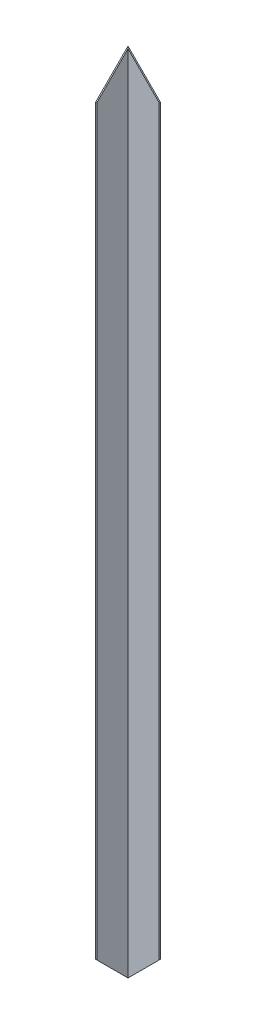
ISO-10303-21;
HEADER;
FILE_DESCRIPTION(('STEP AP214'),'2;1');
FILE_NAME('part.step','',(''),(''),'','','');
FILE_SCHEMA(('AUTOMOTIVE_DESIGN { 1 0 10303 214 1 1 1 1 }'));
ENDSEC;
DATA;
#1=APPLICATION_CONTEXT('core data for automotive mechanical design processes');
#2=APPLICATION_PROTOCOL_DEFINITION('international standard','automotive_design',2000,#1);
#3=PRODUCT_CONTEXT('',#1,'mechanical');
#4=PRODUCT('Part','Part','',(#3));
#5=PRODUCT_RELATED_PRODUCT_CATEGORY('part','',(#4));
#6=PRODUCT_DEFINITION_FORMATION('','',#4);
#7=PRODUCT_DEFINITION_CONTEXT('part definition',#1,'design');
#8=PRODUCT_DEFINITION('design','',#6,#7);
#9=PRODUCT_DEFINITION_SHAPE('','',#8);
#10=(LENGTH_UNIT() NAMED_UNIT(*) SI_UNIT(.MILLI.,.METRE.));
#11=(NAMED_UNIT(*) PLANE_ANGLE_UNIT() SI_UNIT($,.RADIAN.));
#12=(NAMED_UNIT(*) SI_UNIT($,.STERADIAN.) SOLID_ANGLE_UNIT());
#13=UNCERTAINTY_MEASURE_WITH_UNIT(LENGTH_MEASURE(1.E-05),#10,'distance_accuracy_value','');
#14=(GEOMETRIC_REPRESENTATION_CONTEXT(3) GLOBAL_UNCERTAINTY_ASSIGNED_CONTEXT((#13)) GLOBAL_UNIT_ASSIGNED_CONTEXT((#10,
#11,#12)) REPRESENTATION_CONTEXT('',''));
#15=CARTESIAN_POINT('',(0.,0.,0.));
#16=DIRECTION('',(0.,0.,1.));
#17=DIRECTION('',(1.,0.,0.));
#18=AXIS2_PLACEMENT_3D('',#15,#16,#17);
#19=CARTESIAN_POINT('',(-500.,556.568542494924,34.5));
#20=DIRECTION('',(-1.,0.,0.));
#21=DIRECTION('',(0.,0.,1.));
#22=AXIS2_PLACEMENT_3D('',#19,#20,#21);
#23=PLANE('',#22);
#24=DIRECTION('',(0.,-1.,0.));
#25=VECTOR('',#24,1.);
#26=CARTESIAN_POINT('',(-500.,556.568542494924,-4.00000000000003));
#27=LINE('',#26,#25);
#28=CARTESIAN_POINT('',(-500.,498.4,-4.00000000000002));
#29=VERTEX_POINT('',#28);
#30=CARTESIAN_POINT('',(-500.,-498.4,-3.99999999999969));
#31=VERTEX_POINT('',#30);
#32=EDGE_CURVE('E88',#29,#31,#27,.T.);
#33=ORIENTED_EDGE('',*,*,#32,.F.);
#34=DIRECTION('',(0.,0.707106781186544,-0.707106781186552));
#35=VECTOR('',#34,1.);
#36=CARTESIAN_POINT('',(-500.,499.9,-5.50000000000028));
#37=LINE('',#36,#35);
#38=CARTESIAN_POINT('',(-500.,459.900000000001,34.5));
#39=VERTEX_POINT('',#38);
#40=EDGE_CURVE('E48',#39,#29,#37,.T.);
#41=ORIENTED_EDGE('',*,*,#40,.F.);
#42=DIRECTION('',(0.,-1.,0.));
#43=VECTOR('',#42,1.);
#44=CARTESIAN_POINT('',(-500.,556.568542494924,34.5));
#45=LINE('',#44,#43);
#46=CARTESIAN_POINT('',(-500.,-459.900000000001,34.5));
#47=VERTEX_POINT('',#46);
#48=EDGE_CURVE('E103',#39,#47,#45,.T.);
#49=ORIENTED_EDGE('',*,*,#48,.T.);
#50=DIRECTION('',(0.,0.707106781186544,0.707106781186552));
#51=VECTOR('',#50,1.);
#52=CARTESIAN_POINT('',(-500.,-499.9,-5.50000000000028));
#53=LINE('',#52,#51);
#54=EDGE_CURVE('E115',#31,#47,#53,.T.);
#55=ORIENTED_EDGE('',*,*,#54,.F.);
#56=EDGE_LOOP('',(#33,#41,#49,#55));
#57=FACE_BOUND('',#56,.T.);
#58=ADVANCED_FACE('F33',(#57),#23,.F.);
#59=CARTESIAN_POINT('',(-501.5,556.568542494924,34.5));
#60=DIRECTION('',(0.,0.,-1.));
#61=DIRECTION('',(-1.,0.,0.));
#62=AXIS2_PLACEMENT_3D('',#59,#60,#61);
#63=PLANE('',#62);
#64=ORIENTED_EDGE('',*,*,#48,.F.);
#65=DIRECTION('',(-1.,0.,0.));
#66=VECTOR('',#65,1.);
#67=CARTESIAN_POINT('',(-443.431457505076,459.900000000001,34.5));
#68=LINE('',#67,#66);
#69=CARTESIAN_POINT('',(-501.5,459.900000000001,34.5));
#70=VERTEX_POINT('',#69);
#71=EDGE_CURVE('E121',#39,#70,#68,.T.);
#72=ORIENTED_EDGE('',*,*,#71,.T.);
#73=DIRECTION('',(0.,-1.,0.));
#74=VECTOR('',#73,1.);
#75=CARTESIAN_POINT('',(-501.5,556.568542494924,34.5));
#76=LINE('',#75,#74);
#77=CARTESIAN_POINT('',(-501.5,-459.900000000001,34.5));
#78=VERTEX_POINT('',#77);
#79=EDGE_CURVE('E100',#70,#78,#76,.T.);
#80=ORIENTED_EDGE('',*,*,#79,.T.);
#81=DIRECTION('',(-1.,0.,0.));
#82=VECTOR('',#81,1.);
#83=CARTESIAN_POINT('',(-443.431457505076,-459.900000000001,34.5));
#84=LINE('',#83,#82);
#85=EDGE_CURVE('E112',#47,#78,#84,.T.);
#86=ORIENTED_EDGE('',*,*,#85,.F.);
#87=EDGE_LOOP('',(#64,#72,#80,#86));
#88=FACE_BOUND('',#87,.T.);
#89=ADVANCED_FACE('F136',(#88),#63,.F.);
#90=CARTESIAN_POINT('',(-501.5,556.568542494924,-5.5));
#91=DIRECTION('',(1.,0.,0.));
#92=DIRECTION('',(0.,0.,-1.));
#93=AXIS2_PLACEMENT_3D('',#90,#91,#92);
#94=PLANE('',#93);
#95=ORIENTED_EDGE('',*,*,#79,.F.);
#96=DIRECTION('',(0.,-0.707106781186544,0.707106781186552));
#97=VECTOR('',#96,1.);
#98=CARTESIAN_POINT('',(-501.5,499.9,-5.5));
#99=LINE('',#98,#97);
#100=CARTESIAN_POINT('',(-501.5,499.9,-5.5));
#101=VERTEX_POINT('',#100);
#102=EDGE_CURVE('E120',#101,#70,#99,.T.);
#103=ORIENTED_EDGE('',*,*,#102,.F.);
#104=DIRECTION('',(0.,-1.,0.));
#105=VECTOR('',#104,1.);
#106=CARTESIAN_POINT('',(-501.5,556.568542494924,-5.5));
#107=LINE('',#106,#105);
#108=CARTESIAN_POINT('',(-501.5,-499.9,-5.5));
#109=VERTEX_POINT('',#108);
#110=EDGE_CURVE('E95',#101,#109,#107,.T.);
#111=ORIENTED_EDGE('',*,*,#110,.T.);
#112=DIRECTION('',(0.,-0.707106781186543,-0.707106781186551));
#113=VECTOR('',#112,1.);
#114=CARTESIAN_POINT('',(-501.5,-499.9,-5.5));
#115=LINE('',#114,#113);
#116=EDGE_CURVE('E116',#78,#109,#115,.T.);
#117=ORIENTED_EDGE('',*,*,#116,.F.);
#118=EDGE_LOOP('',(#95,#103,#111,#117));
#119=FACE_BOUND('',#118,.T.);
#120=ADVANCED_FACE('F140',(#119),#94,.F.);
#121=CARTESIAN_POINT('',(-461.5,556.568542494924,-5.5));
#122=DIRECTION('',(0.,0.,1.));
#123=DIRECTION('',(1.,0.,0.));
#124=AXIS2_PLACEMENT_3D('',#121,#122,#123);
#125=PLANE('',#124);
#126=ORIENTED_EDGE('',*,*,#110,.F.);
#127=DIRECTION('',(-0.707106781186551,0.707106781186544,0.));
#128=VECTOR('',#127,1.);
#129=CARTESIAN_POINT('',(-501.5,499.9,-5.5));
#130=LINE('',#129,#128);
#131=CARTESIAN_POINT('',(-461.5,459.900000000001,-5.5));
#132=VERTEX_POINT('',#131);
#133=EDGE_CURVE('E89',#132,#101,#130,.T.);
#134=ORIENTED_EDGE('',*,*,#133,.F.);
#135=DIRECTION('',(0.,-1.,0.));
#136=VECTOR('',#135,1.);
#137=CARTESIAN_POINT('',(-461.5,556.568542494924,-5.5));
#138=LINE('',#137,#136);
#139=CARTESIAN_POINT('',(-461.5,-459.900000000001,-5.5));
#140=VERTEX_POINT('',#139);
#141=EDGE_CURVE('E93',#132,#140,#138,.T.);
#142=ORIENTED_EDGE('',*,*,#141,.T.);
#143=DIRECTION('',(0.707106781186553,0.707106781186542,0.));
#144=VECTOR('',#143,1.);
#145=CARTESIAN_POINT('',(-501.5,-499.9,-5.5));
#146=LINE('',#145,#144);
#147=EDGE_CURVE('E78',#109,#140,#146,.T.);
#148=ORIENTED_EDGE('',*,*,#147,.F.);
#149=EDGE_LOOP('',(#126,#134,#142,#148));
#150=FACE_BOUND('',#149,.T.);
#151=ADVANCED_FACE('F149',(#150),#125,.F.);
#152=CARTESIAN_POINT('',(-461.5,556.568542494924,-4.));
#153=DIRECTION('',(-1.,0.,0.));
#154=DIRECTION('',(0.,0.,1.));
#155=AXIS2_PLACEMENT_3D('',#152,#153,#154);
#156=PLANE('',#155);
#157=ORIENTED_EDGE('',*,*,#141,.F.);
#158=DIRECTION('',(0.,0.,-1.));
#159=VECTOR('',#158,1.);
#160=CARTESIAN_POINT('',(-461.5,459.900000000001,52.5685424949234));
#161=LINE('',#160,#159);
#162=CARTESIAN_POINT('',(-461.5,459.900000000001,-4.));
#163=VERTEX_POINT('',#162);
#164=EDGE_CURVE('E92',#163,#132,#161,.T.);
#165=ORIENTED_EDGE('',*,*,#164,.F.);
#166=DIRECTION('',(0.,-1.,0.));
#167=VECTOR('',#166,1.);
#168=CARTESIAN_POINT('',(-461.5,556.568542494924,-4.));
#169=LINE('',#168,#167);
#170=CARTESIAN_POINT('',(-461.5,-459.900000000001,-4.));
#171=VERTEX_POINT('',#170);
#172=EDGE_CURVE('E86',#163,#171,#169,.T.);
#173=ORIENTED_EDGE('',*,*,#172,.T.);
#174=DIRECTION('',(0.,0.,-1.));
#175=VECTOR('',#174,1.);
#176=CARTESIAN_POINT('',(-461.5,-459.900000000001,52.5685424949234));
#177=LINE('',#176,#175);
#178=EDGE_CURVE('E72',#171,#140,#177,.T.);
#179=ORIENTED_EDGE('',*,*,#178,.T.);
#180=EDGE_LOOP('',(#157,#165,#173,#179));
#181=FACE_BOUND('',#180,.T.);
#182=ADVANCED_FACE('F91',(#181),#156,.F.);
#183=CARTESIAN_POINT('',(-500.,556.568542494924,-4.00000000000003));
#184=DIRECTION('',(0.,0.,-1.));
#185=DIRECTION('',(-1.,0.,0.));
#186=AXIS2_PLACEMENT_3D('',#183,#184,#185);
#187=PLANE('',#186);
#188=ORIENTED_EDGE('',*,*,#172,.F.);
#189=DIRECTION('',(0.707106781186551,-0.707106781186544,0.));
#190=VECTOR('',#189,1.);
#191=CARTESIAN_POINT('',(-501.5,499.9,-4.00000000000002));
#192=LINE('',#191,#190);
#193=EDGE_CURVE('E56',#29,#163,#192,.T.);
#194=ORIENTED_EDGE('',*,*,#193,.F.);
#195=ORIENTED_EDGE('',*,*,#32,.T.);
#196=DIRECTION('',(-0.707106781186553,-0.707106781186542,0.));
#197=VECTOR('',#196,1.);
#198=CARTESIAN_POINT('',(-501.5,-499.9,-4.00000000000002));
#199=LINE('',#198,#197);
#200=EDGE_CURVE('E75',#171,#31,#199,.T.);
#201=ORIENTED_EDGE('',*,*,#200,.F.);
#202=EDGE_LOOP('',(#188,#194,#195,#201));
#203=FACE_BOUND('',#202,.T.);
#204=ADVANCED_FACE('F35',(#203),#187,.F.);
#205=CARTESIAN_POINT('',(-501.5,-499.9,52.5685424949234));
#206=DIRECTION('',(-0.707106781186541,0.707106781186553,0.));
#207=DIRECTION('',(-0.707106781186553,-0.707106781186542,0.));
#208=AXIS2_PLACEMENT_3D('',#205,#206,#207);
#209=PLANE('',#208);
#210=ORIENTED_EDGE('',*,*,#200,.T.);
#211=DIRECTION('',(-0.57735026918963,-0.57735026918962,-0.577350269189627));
#212=VECTOR('',#211,1.);
#213=CARTESIAN_POINT('',(-482.143819168359,-480.543819168359,13.8561808316412));
#214=LINE('',#213,#212);
#215=EDGE_CURVE('E11',#31,#109,#214,.T.);
#216=ORIENTED_EDGE('',*,*,#215,.T.);
#217=ORIENTED_EDGE('',*,*,#147,.T.);
#218=ORIENTED_EDGE('',*,*,#178,.F.);
#219=EDGE_LOOP('',(#210,#216,#217,#218));
#220=FACE_BOUND('',#219,.T.);
#221=ADVANCED_FACE('F74',(#220),#209,.F.);
#222=CARTESIAN_POINT('',(-501.5,499.9,52.5685424949234));
#223=DIRECTION('',(-0.707106781186544,-0.707106781186552,0.));
#224=DIRECTION('',(0.707106781186551,-0.707106781186544,0.));
#225=AXIS2_PLACEMENT_3D('',#222,#223,#224);
#226=PLANE('',#225);
#227=ORIENTED_EDGE('',*,*,#133,.T.);
#228=DIRECTION('',(0.577350269189628,-0.577350269189621,0.577350269189628));
#229=VECTOR('',#228,1.);
#230=CARTESIAN_POINT('',(-482.143819168359,480.543819168359,13.8561808316413));
#231=LINE('',#230,#229);
#232=EDGE_CURVE('E41',#101,#29,#231,.T.);
#233=ORIENTED_EDGE('',*,*,#232,.T.);
#234=ORIENTED_EDGE('',*,*,#193,.T.);
#235=ORIENTED_EDGE('',*,*,#164,.T.);
#236=EDGE_LOOP('',(#227,#233,#234,#235));
#237=FACE_BOUND('',#236,.T.);
#238=ADVANCED_FACE('F151',(#237),#226,.F.);
#239=CARTESIAN_POINT('',(-443.431457505076,499.9,-5.5));
#240=DIRECTION('',(0.,-0.707106781186552,-0.707106781186544));
#241=DIRECTION('',(0.,0.707106781186544,-0.707106781186552));
#242=AXIS2_PLACEMENT_3D('',#239,#240,#241);
#243=PLANE('',#242);
#244=ORIENTED_EDGE('',*,*,#102,.T.);
#245=ORIENTED_EDGE('',*,*,#71,.F.);
#246=ORIENTED_EDGE('',*,*,#40,.T.);
#247=ORIENTED_EDGE('',*,*,#232,.F.);
#248=EDGE_LOOP('',(#244,#245,#246,#247));
#249=FACE_BOUND('',#248,.T.);
#250=ADVANCED_FACE('F128',(#249),#243,.F.);
#251=CARTESIAN_POINT('',(-443.431457505076,-499.9,-5.5));
#252=DIRECTION('',(0.,0.707106781186551,-0.707106781186543));
#253=DIRECTION('',(0.,0.707106781186544,0.707106781186552));
#254=AXIS2_PLACEMENT_3D('',#251,#252,#253);
#255=PLANE('',#254);
#256=ORIENTED_EDGE('',*,*,#54,.T.);
#257=ORIENTED_EDGE('',*,*,#85,.T.);
#258=ORIENTED_EDGE('',*,*,#116,.T.);
#259=ORIENTED_EDGE('',*,*,#215,.F.);
#260=EDGE_LOOP('',(#256,#257,#258,#259));
#261=FACE_BOUND('',#260,.T.);
#262=ADVANCED_FACE('F146',(#261),#255,.F.);
#263=CLOSED_SHELL('',(#58,#89,#120,#151,#182,#204,#221,#238,#250,#262));
#264=MANIFOLD_SOLID_BREP('B2',#263);
#265=ADVANCED_BREP_SHAPE_REPRESENTATION('',(#18,#264),#14);
#266=SHAPE_DEFINITION_REPRESENTATION(#9,#265);
ENDSEC;
END-ISO-10303-21;
